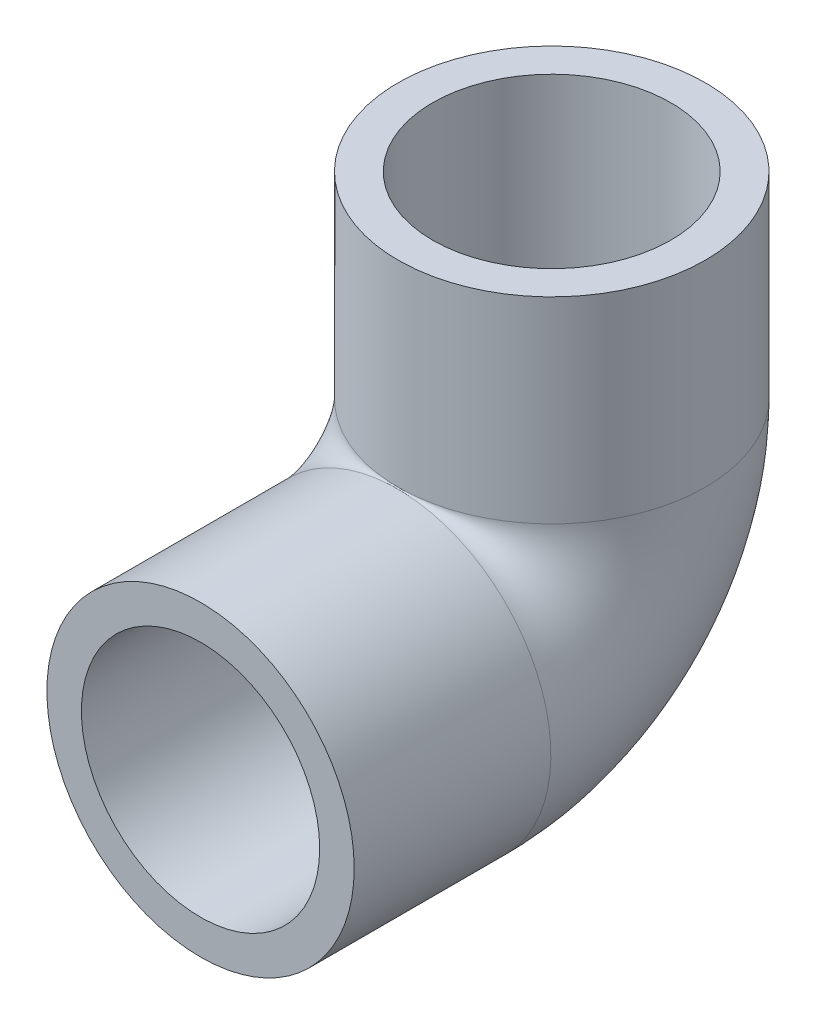
ISO-10303-21;
HEADER;
FILE_DESCRIPTION(('STEP AP214'),'2;1');
FILE_NAME('part.step','',(''),(''),'','','');
FILE_SCHEMA(('AUTOMOTIVE_DESIGN { 1 0 10303 214 1 1 1 1 }'));
ENDSEC;
DATA;
#1=APPLICATION_CONTEXT('core data for automotive mechanical design processes');
#2=APPLICATION_PROTOCOL_DEFINITION('international standard','automotive_design',2000,#1);
#3=PRODUCT_CONTEXT('',#1,'mechanical');
#4=PRODUCT('Part','Part','',(#3));
#5=PRODUCT_RELATED_PRODUCT_CATEGORY('part','',(#4));
#6=PRODUCT_DEFINITION_FORMATION('','',#4);
#7=PRODUCT_DEFINITION_CONTEXT('part definition',#1,'design');
#8=PRODUCT_DEFINITION('design','',#6,#7);
#9=PRODUCT_DEFINITION_SHAPE('','',#8);
#10=(LENGTH_UNIT() NAMED_UNIT(*) SI_UNIT(.MILLI.,.METRE.));
#11=(NAMED_UNIT(*) PLANE_ANGLE_UNIT() SI_UNIT($,.RADIAN.));
#12=(NAMED_UNIT(*) SI_UNIT($,.STERADIAN.) SOLID_ANGLE_UNIT());
#13=UNCERTAINTY_MEASURE_WITH_UNIT(LENGTH_MEASURE(1.E-05),#10,'distance_accuracy_value','');
#14=(GEOMETRIC_REPRESENTATION_CONTEXT(3) GLOBAL_UNCERTAINTY_ASSIGNED_CONTEXT((#13)) GLOBAL_UNIT_ASSIGNED_CONTEXT((#10,
#11,#12)) REPRESENTATION_CONTEXT('',''));
#15=CARTESIAN_POINT('',(0.,0.,0.));
#16=DIRECTION('',(0.,0.,1.));
#17=DIRECTION('',(1.,0.,0.));
#18=AXIS2_PLACEMENT_3D('',#15,#16,#17);
#19=CARTESIAN_POINT('',(0.,13.97,-17.78));
#20=DIRECTION('',(1.,0.,0.));
#21=DIRECTION('',(0.,0.,-1.));
#22=AXIS2_PLACEMENT_3D('',#19,#20,#21);
#23=TOROIDAL_SURFACE('',#22,13.97,8.89);
#24=CARTESIAN_POINT('',(-6.37844074945994,-6.15250620204619,-19.05));
#25=CARTESIAN_POINT('',(-6.55265358811134,-5.97270897004341,-19.05));
#26=CARTESIAN_POINT('',(-6.71924963325663,-5.78557069902349,-19.05));
#27=CARTESIAN_POINT('',(-7.036126640922,-5.39785408510035,-19.05));
#28=CARTESIAN_POINT('',(-7.18640319357505,-5.1972721329966,-19.05));
#29=CARTESIAN_POINT('',(-7.4696691497037,-4.78393540811667,-19.05));
#30=CARTESIAN_POINT('',(-7.60263955128776,-4.57116761836567,-19.05));
#31=CARTESIAN_POINT('',(-7.85017068423849,-4.13517535821175,-19.05));
#32=CARTESIAN_POINT('',(-7.96473115637433,-3.91195074062304,-19.05));
#33=CARTESIAN_POINT('',(-8.17457283771716,-3.45678497671088,-19.05));
#34=CARTESIAN_POINT('',(-8.26986592369114,-3.22484930524622,-19.05));
#35=CARTESIAN_POINT('',(-8.44060317279692,-2.75378003626996,-19.05));
#36=CARTESIAN_POINT('',(-8.5160470252719,-2.51464632616842,-19.05));
#37=CARTESIAN_POINT('',(-8.64653958838355,-2.0309899566447,-19.05));
#38=CARTESIAN_POINT('',(-8.70159716753797,-1.78646968966845,-19.05));
#39=CARTESIAN_POINT('',(-8.79101136260539,-1.29358617762446,-19.05));
#40=CARTESIAN_POINT('',(-8.82536079059621,-1.04522162882963,-19.05));
#41=CARTESIAN_POINT('',(-8.87316358347558,-0.545932697635167,-19.05));
#42=CARTESIAN_POINT('',(-8.88657032999845,-0.295003852305892,-19.05));
#43=CARTESIAN_POINT('',(-8.8922734770001,0.20709782060306,-19.05));
#44=CARTESIAN_POINT('',(-8.88456944479688,0.458270653077971,-19.05));
#45=CARTESIAN_POINT('',(-8.84813304169755,0.959094117650891,-19.05));
#46=CARTESIAN_POINT('',(-8.81939996889569,1.20874469865884,-19.05));
#47=CARTESIAN_POINT('',(-8.74113697253112,1.70476976699208,-19.05));
#48=CARTESIAN_POINT('',(-8.69160651997203,1.95114417082098,-19.05));
#49=CARTESIAN_POINT('',(-8.57185451013886,2.44000702483937,-19.05));
#50=CARTESIAN_POINT('',(-8.50153935408703,2.68247254800679,-19.05));
#51=CARTESIAN_POINT('',(-8.34080660892054,3.16073310754644,-19.05));
#52=CARTESIAN_POINT('',(-8.25038247233881,3.39652594304511,-19.05));
#53=CARTESIAN_POINT('',(-8.05012647106405,3.85967984029267,-19.05));
#54=CARTESIAN_POINT('',(-7.94029739824587,4.08704210929917,-19.05));
#55=CARTESIAN_POINT('',(-7.70201980419061,4.53179156443763,-19.05));
#56=CARTESIAN_POINT('',(-7.57357116501662,4.74917868737522,-19.05));
#57=CARTESIAN_POINT('',(-7.29811067153746,5.17380045370301,-19.05));
#58=CARTESIAN_POINT('',(-7.150987300397,5.38096276182464,-19.05));
#59=CARTESIAN_POINT('',(-6.83991870902255,5.78214057197237,-19.05));
#60=CARTESIAN_POINT('',(-6.67597886392806,5.97616024213086,-19.05));
#61=CARTESIAN_POINT('',(-6.33234691783932,6.34980727003259,-19.05));
#62=CARTESIAN_POINT('',(-6.15265054487344,6.5294306991874,-19.05));
#63=CARTESIAN_POINT('',(-5.77880097090272,6.87293620301891,-19.05));
#64=CARTESIAN_POINT('',(-5.58464810212479,7.03681863924366,-19.05));
#65=CARTESIAN_POINT('',(-5.18258024855418,7.34814123361896,-19.05));
#66=CARTESIAN_POINT('',(-4.97462322043498,7.49552710854928,-19.05));
#67=CARTESIAN_POINT('',(-4.54695287018983,7.77211184423889,-19.05));
#68=CARTESIAN_POINT('',(-4.32723990730704,7.90131126031062,-19.05));
#69=CARTESIAN_POINT('',(-3.87754569675702,8.1404939788153,-19.05));
#70=CARTESIAN_POINT('',(-3.6475629283226,8.25047442334923,-19.05));
#71=CARTESIAN_POINT('',(-3.17907398707908,8.45019120132642,-19.05));
#72=CARTESIAN_POINT('',(-2.94057134415004,8.53993580855791,-19.05));
#73=CARTESIAN_POINT('',(-2.45987084940879,8.69733663913599,-19.05));
#74=CARTESIAN_POINT('',(-2.21776345883891,8.76526904414771,-19.05));
#75=CARTESIAN_POINT('',(-1.72858098729408,8.87996111423802,-19.05));
#76=CARTESIAN_POINT('',(-1.48150595985033,8.92672100734367,-19.05));
#77=CARTESIAN_POINT('',(-0.984285212546029,8.99855256067346,-19.05));
#78=CARTESIAN_POINT('',(-0.734140301182061,9.02362981207311,-19.05));
#79=CARTESIAN_POINT('',(-0.232617894754403,9.05182982779911,-19.05));
#80=CARTESIAN_POINT('',(0.018759571860313,9.054953096487,-19.05));
#81=CARTESIAN_POINT('',(0.513353804620188,9.03944560482782,-19.05));
#82=CARTESIAN_POINT('',(0.756591027849455,9.02145875112137,-19.05));
#83=CARTESIAN_POINT('',(1.24066784103208,8.96498140671673,-19.05));
#84=CARTESIAN_POINT('',(1.48150747679653,8.92649130854625,-19.05));
#85=CARTESIAN_POINT('',(1.95907619949638,8.82941171345989,-19.05));
#86=CARTESIAN_POINT('',(2.19580561370827,8.7708238246136,-19.05));
#87=CARTESIAN_POINT('',(2.66364052660021,8.63409328400183,-19.05));
#88=CARTESIAN_POINT('',(2.89474386168033,8.55594323567732,-19.05));
#89=CARTESIAN_POINT('',(3.35016692003279,8.3806217818884,-19.05));
#90=CARTESIAN_POINT('',(3.57447152643576,8.28341113294343,-19.05));
#91=CARTESIAN_POINT('',(4.0144087358547,8.0708447322389,-19.05));
#92=CARTESIAN_POINT('',(4.23003811332067,7.95548230831805,-19.05));
#93=CARTESIAN_POINT('',(4.65108292851164,7.70757175378529,-19.05));
#94=CARTESIAN_POINT('',(4.85650164906419,7.57502919685121,-19.05));
#95=CARTESIAN_POINT('',(5.25597905150216,7.29363102751744,-19.05));
#96=CARTESIAN_POINT('',(5.45003252152679,7.144768019393,-19.05));
#97=CARTESIAN_POINT('',(5.83100867687358,6.82716794535048,-19.05));
#98=CARTESIAN_POINT('',(6.01754953209855,6.65797259770887,-19.05));
#99=CARTESIAN_POINT('',(6.37581926745785,6.30471539210296,-19.05));
#100=CARTESIAN_POINT('',(6.54755437928516,6.12065985254199,-19.05));
#101=CARTESIAN_POINT('',(6.87519507790134,5.73881857616719,-19.05));
#102=CARTESIAN_POINT('',(7.03109363309841,5.54102680538322,-19.05));
#103=CARTESIAN_POINT('',(7.32583667873847,5.13322537015793,-19.05));
#104=CARTESIAN_POINT('',(7.46468704196691,4.92321995003754,-19.05));
#105=CARTESIAN_POINT('',(7.72600879668106,4.48973454552875,-19.05));
#106=CARTESIAN_POINT('',(7.84825882848079,4.26612106176459,-19.05));
#107=CARTESIAN_POINT('',(8.07344693594014,3.8093762938715,-19.05));
#108=CARTESIAN_POINT('',(8.17638525534277,3.5762451299153,-19.05));
#109=CARTESIAN_POINT('',(8.36218859933833,3.10210862147539,-19.05));
#110=CARTESIAN_POINT('',(8.44505313408284,2.86110308500096,-19.05));
#111=CARTESIAN_POINT('',(8.59007655851628,2.37294516206827,-19.05));
#112=CARTESIAN_POINT('',(8.65223588785182,2.12579290624693,-19.05));
#113=CARTESIAN_POINT('',(8.75521024407407,1.6278799019722,-19.05));
#114=CARTESIAN_POINT('',(8.79609083571064,1.37713271369474,-19.05));
#115=CARTESIAN_POINT('',(8.85646205137526,0.873165387976139,-19.05));
#116=CARTESIAN_POINT('',(8.87596023919226,0.619946156992454,-19.05));
#117=CARTESIAN_POINT('',(8.89342225171104,0.112726527647214,-19.05));
#118=CARTESIAN_POINT('',(8.89138276368565,-0.141273984877296,-19.05));
#119=CARTESIAN_POINT('',(8.86574700201337,-0.648184928173761,-19.05));
#120=CARTESIAN_POINT('',(8.84215082340086,-0.901095363746468,-19.05));
#121=CARTESIAN_POINT('',(8.77375583078849,-1.4024593494625,-19.05));
#122=CARTESIAN_POINT('',(8.72908732816365,-1.65093068201252,-19.05));
#123=CARTESIAN_POINT('',(8.61889563933159,-2.14320488925253,-19.05));
#124=CARTESIAN_POINT('',(8.55337256671114,-2.38700778936201,-19.05));
#125=CARTESIAN_POINT('',(8.4019227474812,-2.86818683650978,-19.05));
#126=CARTESIAN_POINT('',(8.31599639652777,-3.10556310807248,-19.05));
#127=CARTESIAN_POINT('',(8.12433901929039,-3.57218140863061,-19.05));
#128=CARTESIAN_POINT('',(8.01860804283899,-3.80142345809171,-19.05));
#129=CARTESIAN_POINT('',(7.7886502619659,-4.249020832057,-19.05));
#130=CARTESIAN_POINT('',(7.66451620317844,-4.46742381037555,-19.05));
#131=CARTESIAN_POINT('',(7.39820215299085,-4.89304158433434,-19.05));
#132=CARTESIAN_POINT('',(7.25601593671676,-5.10025248534216,-19.05));
#133=CARTESIAN_POINT('',(6.9546673064269,-5.50187538709932,-19.05));
#134=CARTESIAN_POINT('',(6.79550821560564,-5.69628988130267,-19.05));
#135=CARTESIAN_POINT('',(6.46131821985327,-6.07096912852214,-19.05));
#136=CARTESIAN_POINT('',(6.28628702440131,-6.25123362242587,-19.05));
#137=CARTESIAN_POINT('',(5.9221582378114,-6.59578453294764,-19.05));
#138=CARTESIAN_POINT('',(5.73310507894826,-6.76011790897933,-19.05));
#139=CARTESIAN_POINT('',(5.3418040006315,-7.07225156348138,-19.05));
#140=CARTESIAN_POINT('',(5.13955583215232,-7.22005152977852,-19.05));
#141=CARTESIAN_POINT('',(4.72331005112464,-7.4980521459467,-19.05));
#142=CARTESIAN_POINT('',(4.50931262725675,-7.6282530783234,-19.05));
#143=CARTESIAN_POINT('',(4.07108987538269,-7.87012379351695,-19.05));
#144=CARTESIAN_POINT('',(3.84686456269063,-7.9817936040791,-19.05));
#145=CARTESIAN_POINT('',(3.39018408282369,-8.18562219347568,-19.05));
#146=CARTESIAN_POINT('',(3.15774395393405,-8.27781466717863,-19.05));
#147=CARTESIAN_POINT('',(2.68592346418781,-8.44227227142287,-19.05));
#148=CARTESIAN_POINT('',(2.44654325734194,-8.51453784379845,-19.05));
#149=CARTESIAN_POINT('',(1.96254739975653,-8.63862526577819,-19.05));
#150=CARTESIAN_POINT('',(1.71793187029656,-8.6904475884239,-19.05));
#151=CARTESIAN_POINT('',(1.22520727081707,-8.77327878407377,-19.05));
#152=CARTESIAN_POINT('',(0.977098276439946,-8.8042881070268,-19.05));
#153=CARTESIAN_POINT('',(0.479350065306444,-8.84525639351295,-19.05));
#154=CARTESIAN_POINT('',(0.229712244545157,-8.85523231932335,-19.05));
#155=CARTESIAN_POINT('',(-0.269429523398658,-8.85411317088767,-19.05));
#156=CARTESIAN_POINT('',(-0.518933486985621,-8.84302540228637,-19.05));
#157=CARTESIAN_POINT('',(-1.0162277586702,-8.79986321521925,-19.05));
#158=CARTESIAN_POINT('',(-1.26401728343827,-8.76777977101511,-19.05));
#159=CARTESIAN_POINT('',(-1.75600745580795,-8.68284773649598,-19.05));
#160=CARTESIAN_POINT('',(-2.00020816039615,-8.62999947627432,-19.05));
#161=CARTESIAN_POINT('',(-2.48336396148331,-8.50389590252119,-19.05));
#162=CARTESIAN_POINT('',(-2.72231740052259,-8.43063423823628,-19.05));
#163=CARTESIAN_POINT('',(-3.19319699310001,-8.26423683857388,-19.05));
#164=CARTESIAN_POINT('',(-3.42512322920915,-8.17110133682135,-19.05));
#165=CARTESIAN_POINT('',(-3.88006187865779,-7.96572938994331,-19.05));
#166=CARTESIAN_POINT('',(-4.10308362283978,-7.85351362381503,-19.05));
#167=CARTESIAN_POINT('',(-4.53882480249673,-7.61075693695441,-19.05));
#168=CARTESIAN_POINT('',(-4.75154695631042,-7.48022088728832,-19.05));
#169=CARTESIAN_POINT('',(-5.21487975933969,-7.16831067332331,-19.05));
#170=CARTESIAN_POINT('',(-5.4623537840472,-6.98225002895641,-19.05));
#171=CARTESIAN_POINT('',(-5.93657033226603,-6.58535970375744,-19.05));
#172=CARTESIAN_POINT('',(-6.16331285507396,-6.37453002208499,-19.05));
#173=CARTESIAN_POINT('',(-6.37844074945994,-6.15250620204619,-19.05));
#174=B_SPLINE_CURVE_WITH_KNOTS('',3,(#24,#25,#26,#27,#28,#29,#30,#31,#32,#33,#34,#35,#36,#37,
#38,#39,#40,#41,#42,#43,#44,#45,#46,#47,#48,#49,#50,#51,#52,#53,#54,#55,#56,#57,#58,#59,#60,#61,
#62,#63,#64,#65,#66,#67,#68,#69,#70,#71,#72,#73,#74,#75,#76,#77,#78,#79,#80,#81,#82,#83,#84,#85,
#86,#87,#88,#89,#90,#91,#92,#93,#94,#95,#96,#97,#98,#99,#100,#101,#102,#103,#104,#105,#106,#107,
#108,#109,#110,#111,#112,#113,#114,#115,#116,#117,#118,#119,#120,#121,#122,#123,#124,#125,#126,
#127,#128,#129,#130,#131,#132,#133,#134,#135,#136,#137,#138,#139,#140,#141,#142,#143,#144,#145,
#146,#147,#148,#149,#150,#151,#152,#153,#154,#155,#156,#157,#158,#159,#160,#161,#162,#163,#164,
#165,#166,#167,#168,#169,#170,#171,#172,#173),.UNSPECIFIED.,.T.,.F.,(4,2,2,2,2,2,2,2,2,2,2,2,2,
2,2,2,2,2,2,2,2,2,2,2,2,2,2,2,2,2,2,2,2,2,2,2,2,2,2,2,2,2,2,2,2,2,2,2,2,2,2,2,2,2,2,2,2,2,2,2,2,
2,2,2,2,2,2,2,2,2,2,2,2,2,4),(0.,0.750790938646044,1.50178425445916,2.25359531544322,
3.00541696177633,3.75677374914059,4.50814229515696,5.25918359274094,6.01048543134633,
6.7634572951457,7.5164445918104,8.26945702277473,9.02248860831486,9.77896433391011,
10.5356867289291,11.292300339442,12.0489187425777,12.8102889616309,13.5714165737231,
14.3327511875942,15.0940683105167,15.8578212031448,16.621550769983,17.3853938084543,
18.148923967267,18.9023657661011,19.6557994502055,20.4090387927976,21.1622608307303,
21.8930923737279,22.6239099257045,23.354669016953,24.085704830662,24.8182618700711,
25.5510888118136,26.2836785979047,27.0166017451106,27.7712484166429,28.52557589297,
29.2802368476909,30.0346371019781,30.7982742226557,31.5619017044297,32.3255478186662,
33.0891777168923,33.850440553227,34.6114340142998,35.3725445260912,36.1336516824828,
36.8901126397826,37.6465694770027,38.4030116463693,39.1594519123958,39.9122019866425,
40.6652123381472,41.4180755241664,42.1709524932742,42.9215380860812,43.6721378485717,
44.422725560749,45.1733121491155,45.922589428826,46.6718500936596,47.421093420143,
48.1703205484782,48.918943234899,49.6673063195225,50.4159913261705,51.1646644316327,
51.9135707151195,52.6624681953969,53.4105591421628,54.1584515591794,55.0855707630525,
56.0126899983817),.UNSPECIFIED.);
#175=CARTESIAN_POINT('',(-6.37844074945994,-6.15250620204619,-19.05));
#176=VERTEX_POINT('',#175);
#177=EDGE_CURVE('E70',#176,#176,#174,.T.);
#178=ORIENTED_EDGE('',*,*,#177,.F.);
#179=EDGE_LOOP('',(#178));
#180=FACE_BOUND('',#179,.T.);
#181=CARTESIAN_POINT('',(-6.37844074945994,12.7,-37.9025062020462));
#182=CARTESIAN_POINT('',(-6.20474073709434,12.7,-38.0817792957849));
#183=CARTESIAN_POINT('',(-6.0235087976217,12.7,-38.2537124055026));
#184=CARTESIAN_POINT('',(-5.64716302998535,12.7,-38.5817769940014));
#185=CARTESIAN_POINT('',(-5.45204562030667,12.7,-38.7379043706284));
#186=CARTESIAN_POINT('',(-5.04915061627362,12.7,-39.0333321411681));
#187=CARTESIAN_POINT('',(-4.84135989516141,12.7,-39.1726146264416));
#188=CARTESIAN_POINT('',(-4.41477368993109,12.7,-39.433170131034));
#189=CARTESIAN_POINT('',(-4.19597808347778,12.7,-39.5544429500901));
#190=CARTESIAN_POINT('',(-3.74903958943639,12.7,-39.7780581660568));
#191=CARTESIAN_POINT('',(-3.52090088632464,12.7,-39.8804089267105));
#192=CARTESIAN_POINT('',(-3.05680349580103,12.7,-40.0655155332791));
#193=CARTESIAN_POINT('',(-2.82084468574288,12.7,-40.1482710717074));
#194=CARTESIAN_POINT('',(-2.34289167599953,12.7,-40.2935614560021));
#195=CARTESIAN_POINT('',(-2.10090009173362,12.7,-40.3561049057846));
#196=CARTESIAN_POINT('',(-1.61242157983067,12.7,-40.4605898402983));
#197=CARTESIAN_POINT('',(-1.3659331256477,12.7,-40.5025241886546));
#198=CARTESIAN_POINT('',(-0.870489184670927,12.7,-40.5654338652966));
#199=CARTESIAN_POINT('',(-0.621535745595367,12.7,-40.5864253215515));
#200=CARTESIAN_POINT('',(-0.122741566933002,12.7,-40.6073557925204));
#201=CARTESIAN_POINT('',(0.127099186148634,12.7,-40.6072944856678));
#202=CARTESIAN_POINT('',(0.625891097590026,12.7,-40.5861188713894));
#203=CARTESIAN_POINT('',(0.874842240845922,12.7,-40.5650042082066));
#204=CARTESIAN_POINT('',(1.37008539512523,12.7,-40.5018716888228));
#205=CARTESIAN_POINT('',(1.61637734738953,12.7,-40.4598533716836));
#206=CARTESIAN_POINT('',(2.1044293170605,12.7,-40.3552386945175));
#207=CARTESIAN_POINT('',(2.34619142344864,12.7,-40.2926520796028));
#208=CARTESIAN_POINT('',(2.82366922675673,12.7,-40.1473175123827));
#209=CARTESIAN_POINT('',(3.05938280260471,12.7,-40.0645625915159));
#210=CARTESIAN_POINT('',(3.5229598153192,12.7,-39.8795111395284));
#211=CARTESIAN_POINT('',(3.75082468389451,12.7,-39.7772181949251));
#212=CARTESIAN_POINT('',(4.19713685497514,12.7,-39.5538096630043));
#213=CARTESIAN_POINT('',(4.41558400365184,12.7,-39.4326937683821));
#214=CARTESIAN_POINT('',(4.8415873005519,12.7,-39.1724571094743));
#215=CARTESIAN_POINT('',(5.04913940033824,12.7,-39.0333297180226));
#216=CARTESIAN_POINT('',(5.45180028244198,12.7,-38.7380949022095));
#217=CARTESIAN_POINT('',(5.64690878894619,12.7,-38.5819871016833));
#218=CARTESIAN_POINT('',(6.02326316322017,12.7,-38.2539380283375));
#219=CARTESIAN_POINT('',(6.20451157875892,12.7,-38.0819996783668));
#220=CARTESIAN_POINT('',(6.55196745278297,12.7,-37.7234280866016));
#221=CARTESIAN_POINT('',(6.71816967335151,12.7,-37.5367897693803));
#222=CARTESIAN_POINT('',(7.03444274969991,12.7,-37.1500158998863));
#223=CARTESIAN_POINT('',(7.18449813143022,12.7,-36.9498676942762));
#224=CARTESIAN_POINT('',(7.46724212310746,12.7,-36.5376584596463));
#225=CARTESIAN_POINT('',(7.59993067227849,12.7,-36.3255973889406));
#226=CARTESIAN_POINT('',(7.84701080565711,12.7,-35.8910745755146));
#227=CARTESIAN_POINT('',(7.96140258144516,12.7,-35.6686129417273));
#228=CARTESIAN_POINT('',(8.1710983630706,12.7,-35.2148612313877));
#229=CARTESIAN_POINT('',(8.26640181955319,12.7,-34.9835709009768));
#230=CARTESIAN_POINT('',(8.43743896775936,12.7,-34.5133151631004));
#231=CARTESIAN_POINT('',(8.5131312318249,12.7,-34.2743346878905));
#232=CARTESIAN_POINT('',(8.64416488697847,12.7,-33.7908656241887));
#233=CARTESIAN_POINT('',(8.69950680878382,12.7,-33.5463771795159));
#234=CARTESIAN_POINT('',(8.78947380661776,12.7,-33.0536133115813));
#235=CARTESIAN_POINT('',(8.82409846625042,12.7,-32.8053378123064));
#236=CARTESIAN_POINT('',(8.87240916367957,12.7,-32.3067579915974));
#237=CARTESIAN_POINT('',(8.88609512488861,12.7,-32.0564536627458));
#238=CARTESIAN_POINT('',(8.89246997582945,12.7,-31.554668346044));
#239=CARTESIAN_POINT('',(8.88508242456253,12.7,-31.3031863864113));
#240=CARTESIAN_POINT('',(8.84923329663098,12.7,-30.8018158880889));
#241=CARTESIAN_POINT('',(8.82077885824088,12.7,-30.5519268385802));
#242=CARTESIAN_POINT('',(8.7430280663783,12.7,-30.0553626930809));
#243=CARTESIAN_POINT('',(8.69372760843241,12.7,-29.8086882398927));
#244=CARTESIAN_POINT('',(8.57466418543991,12.7,-29.3203343230176));
#245=CARTESIAN_POINT('',(8.50490159540744,12.7,-29.0786547678749));
#246=CARTESIAN_POINT('',(8.34501792721449,12.7,-28.6007235994342));
#247=CARTESIAN_POINT('',(8.2547925654749,12.7,-28.3645068702173));
#248=CARTESIAN_POINT('',(8.05485969419668,12.7,-27.9004713398257));
#249=CARTESIAN_POINT('',(7.94515235905419,12.7,-27.6726524634983));
#250=CARTESIAN_POINT('',(7.70702892792619,12.7,-27.2269509351295));
#251=CARTESIAN_POINT('',(7.57860892885154,12.7,-27.009070368501));
#252=CARTESIAN_POINT('',(7.30404637360189,12.7,-26.5848836054206));
#253=CARTESIAN_POINT('',(7.15790982430748,12.7,-26.3785735204493));
#254=CARTESIAN_POINT('',(6.847945606322,12.7,-25.9776299639012));
#255=CARTESIAN_POINT('',(6.68401293572348,12.7,-25.7830776567558));
#256=CARTESIAN_POINT('',(6.3403773125182,12.7,-25.408445327075));
#257=CARTESIAN_POINT('',(6.16067466254245,12.7,-25.228365026944));
#258=CARTESIAN_POINT('',(5.78672755952672,12.7,-24.8839417404848));
#259=CARTESIAN_POINT('',(5.59248120295244,12.7,-24.7196008206232));
#260=CARTESIAN_POINT('',(5.19081869016024,12.7,-24.4078969101419));
#261=CARTESIAN_POINT('',(4.98340286445328,12.7,-24.2605334937031));
#262=CARTESIAN_POINT('',(4.55663519207021,12.7,-23.9837833884197));
#263=CARTESIAN_POINT('',(4.33727270453344,12.7,-23.8544131028435));
#264=CARTESIAN_POINT('',(3.88839445014319,12.7,-23.6149058000806));
#265=CARTESIAN_POINT('',(3.65888272429197,12.7,-23.5047612129206));
#266=CARTESIAN_POINT('',(3.19122962946149,12.7,-23.3046009022121));
#267=CARTESIAN_POINT('',(2.95308798376286,12.7,-23.2145858247834));
#268=CARTESIAN_POINT('',(2.46989477701372,12.7,-23.0555444010504));
#269=CARTESIAN_POINT('',(2.22484337286445,12.7,-22.9865175785803));
#270=CARTESIAN_POINT('',(1.7344523278292,12.7,-22.8712932840267));
#271=CARTESIAN_POINT('',(1.48921076832092,12.7,-22.8246783628697));
#272=CARTESIAN_POINT('',(0.995616029352046,12.7,-22.7528089567762));
#273=CARTESIAN_POINT('',(0.747262897107208,12.7,-22.7275541481136));
#274=CARTESIAN_POINT('',(0.249345921232905,12.7,-22.6986906987125));
#275=CARTESIAN_POINT('',(-0.00021769719567847,12.7,-22.6950781753614));
#276=CARTESIAN_POINT('',(-0.498714030835583,12.7,-22.7095307245631));
#277=CARTESIAN_POINT('',(-0.74764675504395,12.7,-22.7275954862176));
#278=CARTESIAN_POINT('',(-1.23638014411826,12.7,-22.7844244677845));
#279=CARTESIAN_POINT('',(-1.47624696701141,12.7,-22.82262206295));
#280=CARTESIAN_POINT('',(-1.95193518554062,12.7,-22.9189586491655));
#281=CARTESIAN_POINT('',(-2.18775665419066,12.7,-22.9770972799043));
#282=CARTESIAN_POINT('',(-2.65374178820821,12.7,-23.1127504529645));
#283=CARTESIAN_POINT('',(-2.88390572192769,12.7,-23.1902640743229));
#284=CARTESIAN_POINT('',(-3.33715203088597,12.7,-23.364007360716));
#285=CARTESIAN_POINT('',(-3.56023168959982,12.7,-23.4602441068485));
#286=CARTESIAN_POINT('',(-4.00068164047451,12.7,-23.6720166714738));
#287=CARTESIAN_POINT('',(-4.2179370310439,12.7,-23.7877914340076));
#288=CARTESIAN_POINT('',(-4.64228209740587,12.7,-24.0368666412185));
#289=CARTESIAN_POINT('',(-4.84936723823012,12.7,-24.1701748084153));
#290=CARTESIAN_POINT('',(-5.25189811170459,12.7,-24.4532709742388));
#291=CARTESIAN_POINT('',(-5.44734566644225,12.7,-24.6030563825247));
#292=CARTESIAN_POINT('',(-5.82537330930383,12.7,-24.9180703152201));
#293=CARTESIAN_POINT('',(-6.007953173722,12.7,-25.0832991079979));
#294=CARTESIAN_POINT('',(-6.36392673901389,12.7,-25.4328583599551));
#295=CARTESIAN_POINT('',(-6.53692527033766,12.7,-25.6175914767548));
#296=CARTESIAN_POINT('',(-6.86686717130566,12.7,-26.0008726616443));
#297=CARTESIAN_POINT('',(-7.02381069953958,12.7,-26.1994205932402));
#298=CARTESIAN_POINT('',(-7.32055232060283,12.7,-26.6089611621961));
#299=CARTESIAN_POINT('',(-7.46034929540587,12.7,-26.8199546097282));
#300=CARTESIAN_POINT('',(-7.72178664632811,12.7,-27.2529013290225));
#301=CARTESIAN_POINT('',(-7.84342728090795,12.7,-27.4748544447107));
#302=CARTESIAN_POINT('',(-8.06847027536813,12.7,-27.9297848970168));
#303=CARTESIAN_POINT('',(-8.17173729293923,12.7,-28.1628292059578));
#304=CARTESIAN_POINT('',(-8.35816556738938,12.7,-28.6367329544648));
#305=CARTESIAN_POINT('',(-8.44133376732128,12.7,-28.8775896625654));
#306=CARTESIAN_POINT('',(-8.58699115643763,12.7,-29.3655122230979));
#307=CARTESIAN_POINT('',(-8.64947763678314,12.7,-29.6125788843375));
#308=CARTESIAN_POINT('',(-8.75327268245418,12.7,-30.1111209609941));
#309=CARTESIAN_POINT('',(-8.79458138871771,12.7,-30.3625963470597));
#310=CARTESIAN_POINT('',(-8.85553994668163,12.7,-30.8669048042411));
#311=CARTESIAN_POINT('',(-8.87529520639341,12.7,-31.1197251359195));
#312=CARTESIAN_POINT('',(-8.89333529921488,12.7,-31.6261317801095));
#313=CARTESIAN_POINT('',(-8.89162013854258,12.7,-31.8797180923992));
#314=CARTESIAN_POINT('',(-8.86669974831598,12.7,-32.3858927068961));
#315=CARTESIAN_POINT('',(-8.84348949267714,12.7,-32.6384807618133));
#316=CARTESIAN_POINT('',(-8.77571331348422,12.7,-33.1407712442361));
#317=CARTESIAN_POINT('',(-8.73114781214857,12.7,-33.390473728693));
#318=CARTESIAN_POINT('',(-8.62125836263863,12.7,-33.8838488929583));
#319=CARTESIAN_POINT('',(-8.55604811583731,12.7,-34.1275469003888));
#320=CARTESIAN_POINT('',(-8.40524723499321,12.7,-34.6085472967752));
#321=CARTESIAN_POINT('',(-8.31965706191451,12.7,-34.8458498302521));
#322=CARTESIAN_POINT('',(-8.12879261624476,12.7,-35.3121055637116));
#323=CARTESIAN_POINT('',(-8.02353985263638,12.7,-35.5410675634596));
#324=CARTESIAN_POINT('',(-7.79407205925098,12.7,-35.9891890171027));
#325=CARTESIAN_POINT('',(-7.66986209112909,12.7,-36.2083510674893));
#326=CARTESIAN_POINT('',(-7.37039207334713,12.7,-36.688123885411));
#327=CARTESIAN_POINT('',(-7.19009888631483,12.7,-36.9456126179859));
#328=CARTESIAN_POINT('',(-6.80331949122234,12.7,-37.4401039441508));
#329=CARTESIAN_POINT('',(-6.59683334444279,12.7,-37.6771065856674));
#330=CARTESIAN_POINT('',(-6.37844074945994,12.7,-37.9025062020462));
#331=B_SPLINE_CURVE_WITH_KNOTS('',3,(#181,#182,#183,#184,#185,#186,#187,#188,#189,#190,#191,
#192,#193,#194,#195,#196,#197,#198,#199,#200,#201,#202,#203,#204,#205,#206,#207,#208,#209,#210,
#211,#212,#213,#214,#215,#216,#217,#218,#219,#220,#221,#222,#223,#224,#225,#226,#227,#228,#229,
#230,#231,#232,#233,#234,#235,#236,#237,#238,#239,#240,#241,#242,#243,#244,#245,#246,#247,#248,
#249,#250,#251,#252,#253,#254,#255,#256,#257,#258,#259,#260,#261,#262,#263,#264,#265,#266,#267,
#268,#269,#270,#271,#272,#273,#274,#275,#276,#277,#278,#279,#280,#281,#282,#283,#284,#285,#286,
#287,#288,#289,#290,#291,#292,#293,#294,#295,#296,#297,#298,#299,#300,#301,#302,#303,#304,#305,
#306,#307,#308,#309,#310,#311,#312,#313,#314,#315,#316,#317,#318,#319,#320,#321,#322,#323,#324,
#325,#326,#327,#328,#329,#330),.UNSPECIFIED.,.T.,.F.,(4,2,2,2,2,2,2,2,2,2,2,2,2,2,2,2,2,2,2,2,2,
2,2,2,2,2,2,2,2,2,2,2,2,2,2,2,2,2,2,2,2,2,2,2,2,2,2,2,2,2,2,2,2,2,2,2,2,2,2,2,2,2,2,2,2,2,2,2,2,
2,2,2,2,2,4),(0.,0.748588835138072,1.49737146047884,2.24694328328066,2.99652344049827,
3.74577147931277,4.49503127449141,5.24397170208877,5.9931712851198,6.74179346861925,
7.49042708681553,8.23907335554458,8.98773613310272,9.73604470975876,10.4846122097925,
11.2330424301,11.9814848706062,12.7302034805412,13.4789386801185,14.2275359143038,
14.976392757768,15.7259609813347,16.4755318279741,17.2250948255501,17.9746793921739,
18.7258347405485,19.4769704981257,20.2281213522617,20.9792749538747,21.7331567132454,
22.4867831452158,23.2405580314786,23.9943191040014,24.7520114760379,25.5096970658059,
26.2675409205255,27.0251285395506,27.7874578088451,28.5497724519917,29.3121870447121,
30.0745825108566,30.8376685147233,31.6004533781389,32.3632627220177,33.1260547585615,
33.8740282393719,34.6219903839639,35.3698183405951,36.1176355719182,36.8454491143457,
37.5732495067253,38.3010153107138,39.0290568931386,39.7667505427188,40.5047702015068,
41.2426740036553,41.9805906311534,42.7389712884178,43.4973444537518,44.2557670418983,
45.0141788326547,45.7779646590236,46.5414862603929,47.305107826339,48.0687243103215,
48.8285893207538,49.5884541111233,50.3484966215367,51.1085241056323,51.8644364837391,
52.6203317658395,53.3754049623401,54.1302769026165,55.0714779914264,56.0126768782571),.UNSPECIFIED.);
#332=CARTESIAN_POINT('',(-6.37844074945994,12.7,-37.9025062020462));
#333=VERTEX_POINT('',#332);
#334=EDGE_CURVE('E38',#333,#333,#331,.T.);
#335=ORIENTED_EDGE('',*,*,#334,.F.);
#336=EDGE_LOOP('',(#335));
#337=FACE_BOUND('',#336,.T.);
#338=ADVANCED_FACE('F34',(#180,#337),#23,.F.);
#339=CARTESIAN_POINT('',(0.,0.,0.));
#340=DIRECTION('',(0.,0.,-1.));
#341=DIRECTION('',(-1.,0.,0.));
#342=AXIS2_PLACEMENT_3D('',#339,#340,#341);
#343=CYLINDRICAL_SURFACE('',#342,13.890625);
#344=CARTESIAN_POINT('',(0.,0.,-17.78));
#345=DIRECTION('',(0.,0.,1.));
#346=DIRECTION('',(1.,0.,0.));
#347=AXIS2_PLACEMENT_3D('',#344,#345,#346);
#348=CIRCLE('',#347,13.890625);
#349=CARTESIAN_POINT('',(0.,-13.890625,-17.78));
#350=VERTEX_POINT('',#349);
#351=EDGE_CURVE('E66',#350,#350,#348,.T.);
#352=ORIENTED_EDGE('',*,*,#351,.T.);
#353=EDGE_LOOP('',(#352));
#354=FACE_BOUND('',#353,.T.);
#355=CARTESIAN_POINT('',(0.,0.,0.));
#356=DIRECTION('',(0.,0.,1.));
#357=DIRECTION('',(1.,0.,0.));
#358=AXIS2_PLACEMENT_3D('',#355,#356,#357);
#359=CIRCLE('',#358,13.890625);
#360=CARTESIAN_POINT('',(13.890625,0.,0.));
#361=VERTEX_POINT('',#360);
#362=EDGE_CURVE('E48',#361,#361,#359,.T.);
#363=ORIENTED_EDGE('',*,*,#362,.F.);
#364=EDGE_LOOP('',(#363));
#365=FACE_BOUND('',#364,.T.);
#366=ADVANCED_FACE('F87',(#354,#365),#343,.T.);
#367=CARTESIAN_POINT('',(0.,13.97,-17.78));
#368=DIRECTION('',(1.,0.,0.));
#369=DIRECTION('',(0.,0.,-1.));
#370=AXIS2_PLACEMENT_3D('',#367,#368,#369);
#371=TOROIDAL_SURFACE('',#370,13.97,13.890625);
#372=CARTESIAN_POINT('',(0.,13.97,-31.75));
#373=DIRECTION('',(0.,-1.,0.));
#374=DIRECTION('',(1.,0.,0.));
#375=AXIS2_PLACEMENT_3D('',#372,#373,#374);
#376=CIRCLE('',#375,13.890625);
#377=CARTESIAN_POINT('',(0.,13.97,-45.640625));
#378=VERTEX_POINT('',#377);
#379=EDGE_CURVE('E64',#378,#378,#376,.T.);
#380=CARTESIAN_POINT('',(0.,13.97,-17.78));
#381=DIRECTION('',(1.,0.,0.));
#382=DIRECTION('',(0.,0.,-1.));
#383=AXIS2_PLACEMENT_3D('',#380,#381,#382);
#384=CIRCLE('',#383,27.860625);
#385=EDGE_CURVE('',#350,#378,#384,.T.);
#386=ORIENTED_EDGE('',*,*,#351,.F.);
#387=ORIENTED_EDGE('',*,*,#379,.T.);
#388=ORIENTED_EDGE('',*,*,#385,.T.);
#389=ORIENTED_EDGE('',*,*,#385,.F.);
#390=EDGE_LOOP('',(#386,#388,#387,#389));
#391=FACE_BOUND('',#390,.T.);
#392=ADVANCED_FACE('F61',(#391),#371,.T.);
#393=CARTESIAN_POINT('',(0.,13.97,-31.75));
#394=DIRECTION('',(0.,1.,0.));
#395=DIRECTION('',(0.,0.,1.));
#396=AXIS2_PLACEMENT_3D('',#393,#394,#395);
#397=CYLINDRICAL_SURFACE('',#396,13.890625);
#398=CARTESIAN_POINT('',(0.,31.75,-31.75));
#399=DIRECTION('',(0.,-1.,0.));
#400=DIRECTION('',(1.,0.,0.));
#401=AXIS2_PLACEMENT_3D('',#398,#399,#400);
#402=CIRCLE('',#401,13.890625);
#403=CARTESIAN_POINT('',(13.890625,31.75,-31.75));
#404=VERTEX_POINT('',#403);
#405=EDGE_CURVE('E11',#404,#404,#402,.T.);
#406=ORIENTED_EDGE('',*,*,#405,.T.);
#407=EDGE_LOOP('',(#406));
#408=FACE_BOUND('',#407,.T.);
#409=ORIENTED_EDGE('',*,*,#379,.F.);
#410=EDGE_LOOP('',(#409));
#411=FACE_BOUND('',#410,.T.);
#412=ADVANCED_FACE('F36',(#408,#411),#397,.T.);
#413=CARTESIAN_POINT('',(0.,0.,0.));
#414=DIRECTION('',(0.,0.,1.));
#415=DIRECTION('',(1.,0.,0.));
#416=AXIS2_PLACEMENT_3D('',#413,#414,#415);
#417=PLANE('',#416);
#418=CARTESIAN_POINT('',(0.,0.,0.));
#419=DIRECTION('',(0.,0.,1.));
#420=DIRECTION('',(1.,0.,0.));
#421=AXIS2_PLACEMENT_3D('',#418,#419,#420);
#422=CIRCLE('',#421,10.7696);
#423=CARTESIAN_POINT('',(10.7696,0.,0.));
#424=VERTEX_POINT('',#423);
#425=EDGE_CURVE('E206',#424,#424,#422,.T.);
#426=ORIENTED_EDGE('',*,*,#425,.F.);
#427=EDGE_LOOP('',(#426));
#428=FACE_BOUND('',#427,.T.);
#429=ORIENTED_EDGE('',*,*,#362,.T.);
#430=EDGE_LOOP('',(#429));
#431=FACE_BOUND('',#430,.T.);
#432=ADVANCED_FACE('F60',(#428,#431),#417,.T.);
#433=CARTESIAN_POINT('',(0.,31.75,-31.75));
#434=DIRECTION('',(0.,-1.,0.));
#435=DIRECTION('',(1.,0.,0.));
#436=AXIS2_PLACEMENT_3D('',#433,#434,#435);
#437=PLANE('',#436);
#438=CARTESIAN_POINT('',(0.,31.75,-31.75));
#439=DIRECTION('',(0.,1.,0.));
#440=DIRECTION('',(0.,0.,1.));
#441=AXIS2_PLACEMENT_3D('',#438,#439,#440);
#442=CIRCLE('',#441,10.7696);
#443=CARTESIAN_POINT('',(0.,31.75,-20.9804));
#444=VERTEX_POINT('',#443);
#445=EDGE_CURVE('E200',#444,#444,#442,.T.);
#446=ORIENTED_EDGE('',*,*,#445,.F.);
#447=EDGE_LOOP('',(#446));
#448=FACE_BOUND('',#447,.T.);
#449=ORIENTED_EDGE('',*,*,#405,.F.);
#450=EDGE_LOOP('',(#449));
#451=FACE_BOUND('',#450,.T.);
#452=ADVANCED_FACE('F56',(#448,#451),#437,.F.);
#453=CARTESIAN_POINT('',(0.,0.,-19.05));
#454=DIRECTION('',(0.,0.,1.));
#455=DIRECTION('',(1.,0.,0.));
#456=AXIS2_PLACEMENT_3D('',#453,#454,#455);
#457=PLANE('',#456);
#458=CARTESIAN_POINT('',(0.,0.,-19.05));
#459=DIRECTION('',(0.,0.,1.));
#460=DIRECTION('',(1.,0.,0.));
#461=AXIS2_PLACEMENT_3D('',#458,#459,#460);
#462=CIRCLE('',#461,10.7696);
#463=CARTESIAN_POINT('',(10.7696,0.,-19.05));
#464=VERTEX_POINT('',#463);
#465=EDGE_CURVE('E77',#464,#464,#462,.T.);
#466=ORIENTED_EDGE('',*,*,#465,.T.);
#467=EDGE_LOOP('',(#466));
#468=FACE_BOUND('',#467,.T.);
#469=ORIENTED_EDGE('',*,*,#177,.T.);
#470=EDGE_LOOP('',(#469));
#471=FACE_BOUND('',#470,.T.);
#472=ADVANCED_FACE('F81',(#468,#471),#457,.T.);
#473=CARTESIAN_POINT('',(0.,0.,-19.05));
#474=DIRECTION('',(0.,0.,1.));
#475=DIRECTION('',(1.,0.,0.));
#476=AXIS2_PLACEMENT_3D('',#473,#474,#475);
#477=CYLINDRICAL_SURFACE('',#476,10.7696);
#478=CARTESIAN_POINT('',(10.7696,0.,-19.05));
#479=CARTESIAN_POINT('',(10.7696,0.,-18.8515625));
#480=CARTESIAN_POINT('',(10.7696,0.,-18.653125));
#481=CARTESIAN_POINT('',(10.7696,0.,-18.25625));
#482=CARTESIAN_POINT('',(10.7696,0.,-18.0578125));
#483=CARTESIAN_POINT('',(10.7696,0.,-17.6609375));
#484=CARTESIAN_POINT('',(10.7696,0.,-17.4625));
#485=CARTESIAN_POINT('',(10.7696,0.,-17.065625));
#486=CARTESIAN_POINT('',(10.7696,0.,-16.8671875));
#487=CARTESIAN_POINT('',(10.7696,0.,-16.4703125));
#488=CARTESIAN_POINT('',(10.7696,0.,-16.271875));
#489=CARTESIAN_POINT('',(10.7696,0.,-15.875));
#490=CARTESIAN_POINT('',(10.7696,0.,-15.6765625));
#491=CARTESIAN_POINT('',(10.7696,0.,-15.2796875));
#492=CARTESIAN_POINT('',(10.7696,0.,-15.08125));
#493=CARTESIAN_POINT('',(10.7696,0.,-14.684375));
#494=CARTESIAN_POINT('',(10.7696,0.,-14.4859375));
#495=CARTESIAN_POINT('',(10.7696,0.,-14.0890625));
#496=CARTESIAN_POINT('',(10.7696,0.,-13.890625));
#497=CARTESIAN_POINT('',(10.7696,0.,-13.49375));
#498=CARTESIAN_POINT('',(10.7696,0.,-13.2953125));
#499=CARTESIAN_POINT('',(10.7696,0.,-12.8984375));
#500=CARTESIAN_POINT('',(10.7696,0.,-12.7));
#501=CARTESIAN_POINT('',(10.7696,0.,-12.303125));
#502=CARTESIAN_POINT('',(10.7696,0.,-12.1046875));
#503=CARTESIAN_POINT('',(10.7696,0.,-11.7078125));
#504=CARTESIAN_POINT('',(10.7696,0.,-11.509375));
#505=CARTESIAN_POINT('',(10.7696,0.,-11.1125));
#506=CARTESIAN_POINT('',(10.7696,0.,-10.9140625));
#507=CARTESIAN_POINT('',(10.7696,0.,-10.5171875));
#508=CARTESIAN_POINT('',(10.7696,0.,-10.31875));
#509=CARTESIAN_POINT('',(10.7696,0.,-9.921875));
#510=CARTESIAN_POINT('',(10.7696,0.,-9.7234375));
#511=CARTESIAN_POINT('',(10.7696,0.,-9.3265625));
#512=CARTESIAN_POINT('',(10.7696,0.,-9.128125));
#513=CARTESIAN_POINT('',(10.7696,0.,-8.73125));
#514=CARTESIAN_POINT('',(10.7696,0.,-8.5328125));
#515=CARTESIAN_POINT('',(10.7696,0.,-8.1359375));
#516=CARTESIAN_POINT('',(10.7696,0.,-7.9375));
#517=CARTESIAN_POINT('',(10.7696,0.,-7.540625));
#518=CARTESIAN_POINT('',(10.7696,0.,-7.3421875));
#519=CARTESIAN_POINT('',(10.7696,0.,-6.9453125));
#520=CARTESIAN_POINT('',(10.7696,0.,-6.746875));
#521=CARTESIAN_POINT('',(10.7696,0.,-6.35));
#522=CARTESIAN_POINT('',(10.7696,0.,-6.1515625));
#523=CARTESIAN_POINT('',(10.7696,0.,-5.7546875));
#524=CARTESIAN_POINT('',(10.7696,0.,-5.55625));
#525=CARTESIAN_POINT('',(10.7696,0.,-5.159375));
#526=CARTESIAN_POINT('',(10.7696,0.,-4.9609375));
#527=CARTESIAN_POINT('',(10.7696,0.,-4.5640625));
#528=CARTESIAN_POINT('',(10.7696,0.,-4.365625));
#529=CARTESIAN_POINT('',(10.7696,0.,-3.96875));
#530=CARTESIAN_POINT('',(10.7696,0.,-3.7703125));
#531=CARTESIAN_POINT('',(10.7696,0.,-3.3734375));
#532=CARTESIAN_POINT('',(10.7696,0.,-3.175));
#533=CARTESIAN_POINT('',(10.7696,0.,-2.778125));
#534=CARTESIAN_POINT('',(10.7696,0.,-2.5796875));
#535=CARTESIAN_POINT('',(10.7696,0.,-2.1828125));
#536=CARTESIAN_POINT('',(10.7696,0.,-1.984375));
#537=CARTESIAN_POINT('',(10.7696,0.,-1.5875));
#538=CARTESIAN_POINT('',(10.7696,0.,-1.3890625));
#539=CARTESIAN_POINT('',(10.7696,0.,-0.992187500000001));
#540=CARTESIAN_POINT('',(10.7696,0.,-0.793750000000001));
#541=CARTESIAN_POINT('',(10.7696,0.,-0.396875));
#542=CARTESIAN_POINT('',(10.7696,0.,-0.1984375));
#543=CARTESIAN_POINT('',(10.7696,0.,0.));
#544=B_SPLINE_CURVE_WITH_KNOTS('',3,(#478,#479,#480,#481,#482,#483,#484,#485,#486,#487,#488,
#489,#490,#491,#492,#493,#494,#495,#496,#497,#498,#499,#500,#501,#502,#503,#504,#505,#506,#507,
#508,#509,#510,#511,#512,#513,#514,#515,#516,#517,#518,#519,#520,#521,#522,#523,#524,#525,#526,
#527,#528,#529,#530,#531,#532,#533,#534,#535,#536,#537,#538,#539,#540,#541,#542,#543),
.UNSPECIFIED.,.F.,.F.,(4,2,2,2,2,2,2,2,2,2,2,2,2,2,2,2,2,2,2,2,2,2,2,2,2,2,2,2,2,2,2,2,4),(0.,
0.595312499999997,1.190625,1.7859375,2.38125,2.9765625,3.571875,4.1671875,4.7625,5.3578125,
5.953125,6.5484375,7.14375,7.7390625,8.334375,8.9296875,9.525,10.1203125,10.715625,11.3109375,
11.90625,12.5015625,13.096875,13.6921875,14.2875,14.8828125,15.478125,16.0734375,16.66875,
17.2640625,17.859375,18.4546875,19.05),.UNSPECIFIED.);
#545=EDGE_CURVE('BSEAM85',#464,#424,#544,.T.);
#546=ORIENTED_EDGE('',*,*,#465,.F.);
#547=ORIENTED_EDGE('',*,*,#425,.T.);
#548=ORIENTED_EDGE('',*,*,#545,.T.);
#549=ORIENTED_EDGE('',*,*,#545,.F.);
#550=EDGE_LOOP('',(#546,#548,#547,#549));
#551=FACE_BOUND('',#550,.T.);
#552=ADVANCED_FACE('F85',(#551),#477,.F.);
#553=CARTESIAN_POINT('',(0.,12.7,-31.75));
#554=DIRECTION('',(0.,1.,0.));
#555=DIRECTION('',(0.,0.,1.));
#556=AXIS2_PLACEMENT_3D('',#553,#554,#555);
#557=PLANE('',#556);
#558=CARTESIAN_POINT('',(0.,12.7,-31.75));
#559=DIRECTION('',(0.,1.,0.));
#560=DIRECTION('',(0.,0.,1.));
#561=AXIS2_PLACEMENT_3D('',#558,#559,#560);
#562=CIRCLE('',#561,10.7696);
#563=CARTESIAN_POINT('',(0.,12.7,-20.9804));
#564=VERTEX_POINT('',#563);
#565=EDGE_CURVE('E198',#564,#564,#562,.T.);
#566=ORIENTED_EDGE('',*,*,#565,.T.);
#567=EDGE_LOOP('',(#566));
#568=FACE_BOUND('',#567,.T.);
#569=ORIENTED_EDGE('',*,*,#334,.T.);
#570=EDGE_LOOP('',(#569));
#571=FACE_BOUND('',#570,.T.);
#572=ADVANCED_FACE('F90',(#568,#571),#557,.T.);
#573=CARTESIAN_POINT('',(0.,12.7,-31.75));
#574=DIRECTION('',(0.,1.,0.));
#575=DIRECTION('',(0.,0.,1.));
#576=AXIS2_PLACEMENT_3D('',#573,#574,#575);
#577=CYLINDRICAL_SURFACE('',#576,10.7696);
#578=CARTESIAN_POINT('',(0.,12.7,-20.9804));
#579=CARTESIAN_POINT('',(0.,12.8984375,-20.9804));
#580=CARTESIAN_POINT('',(0.,13.096875,-20.9804));
#581=CARTESIAN_POINT('',(0.,13.49375,-20.9804));
#582=CARTESIAN_POINT('',(0.,13.6921875,-20.9804));
#583=CARTESIAN_POINT('',(0.,14.0890625,-20.9804));
#584=CARTESIAN_POINT('',(0.,14.2875,-20.9804));
#585=CARTESIAN_POINT('',(0.,14.684375,-20.9804));
#586=CARTESIAN_POINT('',(0.,14.8828125,-20.9804));
#587=CARTESIAN_POINT('',(0.,15.2796875,-20.9804));
#588=CARTESIAN_POINT('',(0.,15.478125,-20.9804));
#589=CARTESIAN_POINT('',(0.,15.875,-20.9804));
#590=CARTESIAN_POINT('',(0.,16.0734375,-20.9804));
#591=CARTESIAN_POINT('',(0.,16.4703125,-20.9804));
#592=CARTESIAN_POINT('',(0.,16.66875,-20.9804));
#593=CARTESIAN_POINT('',(0.,17.065625,-20.9804));
#594=CARTESIAN_POINT('',(0.,17.2640625,-20.9804));
#595=CARTESIAN_POINT('',(0.,17.6609375,-20.9804));
#596=CARTESIAN_POINT('',(0.,17.859375,-20.9804));
#597=CARTESIAN_POINT('',(0.,18.25625,-20.9804));
#598=CARTESIAN_POINT('',(0.,18.4546875,-20.9804));
#599=CARTESIAN_POINT('',(0.,18.8515625,-20.9804));
#600=CARTESIAN_POINT('',(0.,19.05,-20.9804));
#601=CARTESIAN_POINT('',(0.,19.446875,-20.9804));
#602=CARTESIAN_POINT('',(0.,19.6453125,-20.9804));
#603=CARTESIAN_POINT('',(0.,20.0421875,-20.9804));
#604=CARTESIAN_POINT('',(0.,20.240625,-20.9804));
#605=CARTESIAN_POINT('',(0.,20.6375,-20.9804));
#606=CARTESIAN_POINT('',(0.,20.8359375,-20.9804));
#607=CARTESIAN_POINT('',(0.,21.2328125,-20.9804));
#608=CARTESIAN_POINT('',(0.,21.43125,-20.9804));
#609=CARTESIAN_POINT('',(0.,21.828125,-20.9804));
#610=CARTESIAN_POINT('',(0.,22.0265625,-20.9804));
#611=CARTESIAN_POINT('',(0.,22.4234375,-20.9804));
#612=CARTESIAN_POINT('',(0.,22.621875,-20.9804));
#613=CARTESIAN_POINT('',(0.,23.01875,-20.9804));
#614=CARTESIAN_POINT('',(0.,23.2171875,-20.9804));
#615=CARTESIAN_POINT('',(0.,23.6140625,-20.9804));
#616=CARTESIAN_POINT('',(0.,23.8125,-20.9804));
#617=CARTESIAN_POINT('',(0.,24.209375,-20.9804));
#618=CARTESIAN_POINT('',(0.,24.4078125,-20.9804));
#619=CARTESIAN_POINT('',(0.,24.8046875,-20.9804));
#620=CARTESIAN_POINT('',(0.,25.003125,-20.9804));
#621=CARTESIAN_POINT('',(0.,25.4,-20.9804));
#622=CARTESIAN_POINT('',(0.,25.5984375,-20.9804));
#623=CARTESIAN_POINT('',(0.,25.9953125,-20.9804));
#624=CARTESIAN_POINT('',(0.,26.19375,-20.9804));
#625=CARTESIAN_POINT('',(0.,26.590625,-20.9804));
#626=CARTESIAN_POINT('',(0.,26.7890625,-20.9804));
#627=CARTESIAN_POINT('',(0.,27.1859375,-20.9804));
#628=CARTESIAN_POINT('',(0.,27.384375,-20.9804));
#629=CARTESIAN_POINT('',(0.,27.78125,-20.9804));
#630=CARTESIAN_POINT('',(0.,27.9796875,-20.9804));
#631=CARTESIAN_POINT('',(0.,28.3765625,-20.9804));
#632=CARTESIAN_POINT('',(0.,28.575,-20.9804));
#633=CARTESIAN_POINT('',(0.,28.971875,-20.9804));
#634=CARTESIAN_POINT('',(0.,29.1703125,-20.9804));
#635=CARTESIAN_POINT('',(0.,29.5671875,-20.9804));
#636=CARTESIAN_POINT('',(0.,29.765625,-20.9804));
#637=CARTESIAN_POINT('',(0.,30.1625,-20.9804));
#638=CARTESIAN_POINT('',(0.,30.3609375,-20.9804));
#639=CARTESIAN_POINT('',(0.,30.7578125,-20.9804));
#640=CARTESIAN_POINT('',(0.,30.95625,-20.9804));
#641=CARTESIAN_POINT('',(0.,31.353125,-20.9804));
#642=CARTESIAN_POINT('',(0.,31.5515625,-20.9804));
#643=CARTESIAN_POINT('',(0.,31.75,-20.9804));
#644=B_SPLINE_CURVE_WITH_KNOTS('',3,(#578,#579,#580,#581,#582,#583,#584,#585,#586,#587,#588,
#589,#590,#591,#592,#593,#594,#595,#596,#597,#598,#599,#600,#601,#602,#603,#604,#605,#606,#607,
#608,#609,#610,#611,#612,#613,#614,#615,#616,#617,#618,#619,#620,#621,#622,#623,#624,#625,#626,
#627,#628,#629,#630,#631,#632,#633,#634,#635,#636,#637,#638,#639,#640,#641,#642,#643),
.UNSPECIFIED.,.F.,.F.,(4,2,2,2,2,2,2,2,2,2,2,2,2,2,2,2,2,2,2,2,2,2,2,2,2,2,2,2,2,2,2,2,4),(0.,
0.595312499999999,1.190625,1.7859375,2.38125,2.9765625,3.571875,4.1671875,4.7625,5.3578125,
5.953125,6.5484375,7.14375,7.7390625,8.33437499999999,8.92968749999999,9.525,10.1203125,
10.715625,11.3109375,11.90625,12.5015625,13.096875,13.6921875,14.2875,14.8828125,15.478125,
16.0734375,16.66875,17.2640625,17.859375,18.4546875,19.05),.UNSPECIFIED.);
#645=EDGE_CURVE('BSEAM88',#564,#444,#644,.T.);
#646=ORIENTED_EDGE('',*,*,#565,.F.);
#647=ORIENTED_EDGE('',*,*,#445,.T.);
#648=ORIENTED_EDGE('',*,*,#645,.T.);
#649=ORIENTED_EDGE('',*,*,#645,.F.);
#650=EDGE_LOOP('',(#646,#648,#647,#649));
#651=FACE_BOUND('',#650,.T.);
#652=ADVANCED_FACE('F88',(#651),#577,.F.);
#653=CLOSED_SHELL('',(#338,#366,#392,#412,#432,#452,#472,#552,#572,#652));
#654=MANIFOLD_SOLID_BREP('B2',#653);
#655=ADVANCED_BREP_SHAPE_REPRESENTATION('',(#18,#654),#14);
#656=SHAPE_DEFINITION_REPRESENTATION(#9,#655);
ENDSEC;
END-ISO-10303-21;
